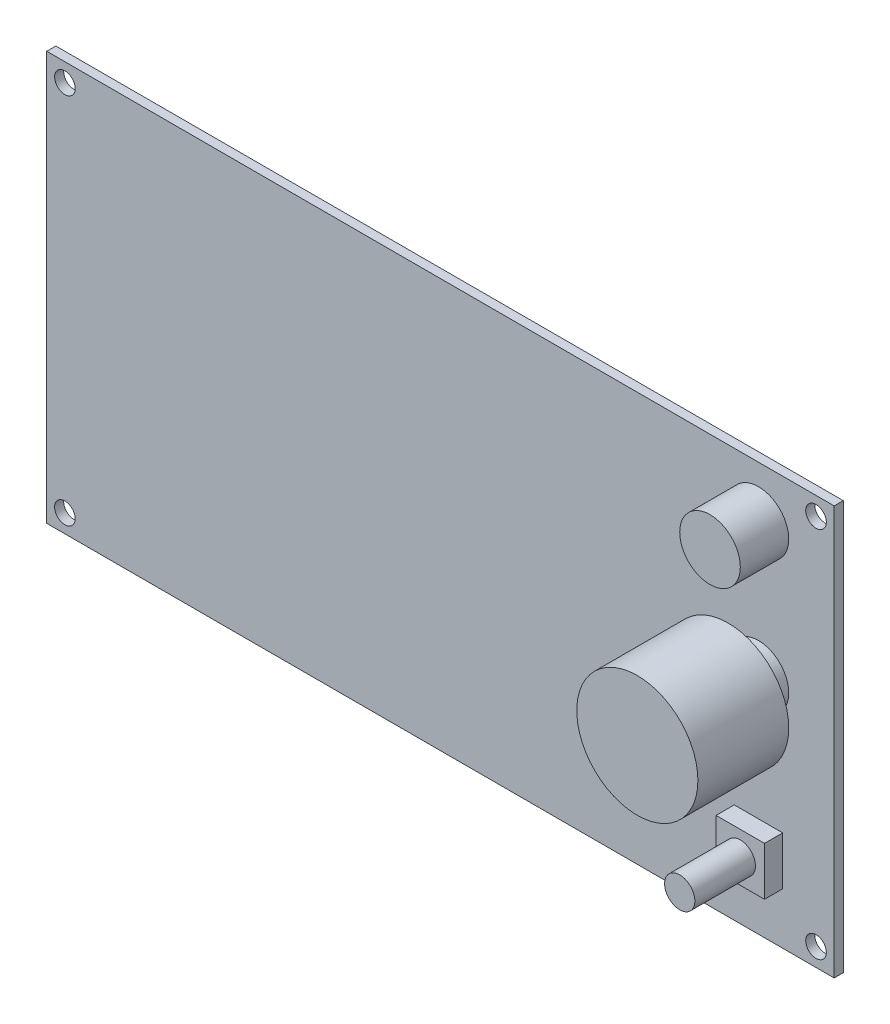
ISO-10303-21;
HEADER;
FILE_DESCRIPTION(('STEP AP214'),'2;1');
FILE_NAME('part.step','',(''),(''),'','','');
FILE_SCHEMA(('AUTOMOTIVE_DESIGN { 1 0 10303 214 1 1 1 1 }'));
ENDSEC;
DATA;
#1=APPLICATION_CONTEXT('core data for automotive mechanical design processes');
#2=APPLICATION_PROTOCOL_DEFINITION('international standard','automotive_design',2000,#1);
#3=PRODUCT_CONTEXT('',#1,'mechanical');
#4=PRODUCT('Part','Part','',(#3));
#5=PRODUCT_RELATED_PRODUCT_CATEGORY('part','',(#4));
#6=PRODUCT_DEFINITION_FORMATION('','',#4);
#7=PRODUCT_DEFINITION_CONTEXT('part definition',#1,'design');
#8=PRODUCT_DEFINITION('design','',#6,#7);
#9=PRODUCT_DEFINITION_SHAPE('','',#8);
#10=(LENGTH_UNIT() NAMED_UNIT(*) SI_UNIT(.MILLI.,.METRE.));
#11=(NAMED_UNIT(*) PLANE_ANGLE_UNIT() SI_UNIT($,.RADIAN.));
#12=(NAMED_UNIT(*) SI_UNIT($,.STERADIAN.) SOLID_ANGLE_UNIT());
#13=UNCERTAINTY_MEASURE_WITH_UNIT(LENGTH_MEASURE(1.E-05),#10,'distance_accuracy_value','');
#14=(GEOMETRIC_REPRESENTATION_CONTEXT(3) GLOBAL_UNCERTAINTY_ASSIGNED_CONTEXT((#13)) GLOBAL_UNIT_ASSIGNED_CONTEXT((#10,
#11,#12)) REPRESENTATION_CONTEXT('',''));
#15=CARTESIAN_POINT('',(0.,0.,0.));
#16=DIRECTION('',(0.,0.,1.));
#17=DIRECTION('',(1.,0.,0.));
#18=AXIS2_PLACEMENT_3D('',#15,#16,#17);
#19=CARTESIAN_POINT('',(0.,0.,0.));
#20=DIRECTION('',(0.,0.,-1.));
#21=DIRECTION('',(-1.,0.,0.));
#22=AXIS2_PLACEMENT_3D('',#19,#20,#21);
#23=PLANE('',#22);
#24=DIRECTION('',(0.,-1.,0.));
#25=VECTOR('',#24,1.);
#26=CARTESIAN_POINT('',(80.,36.5,0.));
#27=LINE('',#26,#25);
#28=CARTESIAN_POINT('',(80.,36.5,0.));
#29=VERTEX_POINT('',#28);
#30=CARTESIAN_POINT('',(80.,29.,0.));
#31=VERTEX_POINT('',#30);
#32=EDGE_CURVE('E61',#29,#31,#27,.T.);
#33=ORIENTED_EDGE('',*,*,#32,.F.);
#34=DIRECTION('',(1.,0.,0.));
#35=VECTOR('',#34,1.);
#36=CARTESIAN_POINT('',(80.,36.5,0.));
#37=LINE('',#36,#35);
#38=CARTESIAN_POINT('',(30.,36.5,0.));
#39=VERTEX_POINT('',#38);
#40=EDGE_CURVE('E186',#39,#29,#37,.T.);
#41=ORIENTED_EDGE('',*,*,#40,.F.);
#42=DIRECTION('',(0.,1.,0.));
#43=VECTOR('',#42,1.);
#44=CARTESIAN_POINT('',(30.,36.5,0.));
#45=LINE('',#44,#43);
#46=CARTESIAN_POINT('',(30.,29.,0.));
#47=VERTEX_POINT('',#46);
#48=EDGE_CURVE('E195',#47,#39,#45,.T.);
#49=ORIENTED_EDGE('',*,*,#48,.F.);
#50=DIRECTION('',(-1.,0.,0.));
#51=VECTOR('',#50,1.);
#52=CARTESIAN_POINT('',(80.,29.,0.));
#53=LINE('',#52,#51);
#54=EDGE_CURVE('E177',#31,#47,#53,.T.);
#55=ORIENTED_EDGE('',*,*,#54,.F.);
#56=EDGE_LOOP('',(#33,#41,#49,#55));
#57=FACE_BOUND('',#56,.T.);
#58=CARTESIAN_POINT('',(124.,61.5,0.));
#59=DIRECTION('',(0.,0.,1.));
#60=DIRECTION('',(1.,0.,0.));
#61=AXIS2_PLACEMENT_3D('',#58,#59,#60);
#62=CIRCLE('',#61,1.70000000000001);
#63=CARTESIAN_POINT('',(125.7,61.5,0.));
#64=VERTEX_POINT('',#63);
#65=EDGE_CURVE('E262',#64,#64,#62,.T.);
#66=ORIENTED_EDGE('',*,*,#65,.T.);
#67=EDGE_LOOP('',(#66));
#68=FACE_BOUND('',#67,.T.);
#69=CARTESIAN_POINT('',(0.,0.,0.));
#70=DIRECTION('',(0.,0.,1.));
#71=DIRECTION('',(1.,0.,0.));
#72=AXIS2_PLACEMENT_3D('',#69,#70,#71);
#73=CIRCLE('',#72,1.7);
#74=CARTESIAN_POINT('',(1.7,0.,0.));
#75=VERTEX_POINT('',#74);
#76=EDGE_CURVE('E274',#75,#75,#73,.T.);
#77=ORIENTED_EDGE('',*,*,#76,.T.);
#78=EDGE_LOOP('',(#77));
#79=FACE_BOUND('',#78,.T.);
#80=DIRECTION('',(1.,0.,0.));
#81=VECTOR('',#80,1.);
#82=CARTESIAN_POINT('',(-3.,-3.,0.));
#83=LINE('',#82,#81);
#84=CARTESIAN_POINT('',(-3.,-3.,0.));
#85=VERTEX_POINT('',#84);
#86=CARTESIAN_POINT('',(127.,-3.,0.));
#87=VERTEX_POINT('',#86);
#88=EDGE_CURVE('E280',#85,#87,#83,.T.);
#89=ORIENTED_EDGE('',*,*,#88,.F.);
#90=DIRECTION('',(0.,-1.,0.));
#91=VECTOR('',#90,1.);
#92=CARTESIAN_POINT('',(-3.,-3.,0.));
#93=LINE('',#92,#91);
#94=CARTESIAN_POINT('',(-3.,64.5,0.));
#95=VERTEX_POINT('',#94);
#96=EDGE_CURVE('E287',#95,#85,#93,.T.);
#97=ORIENTED_EDGE('',*,*,#96,.F.);
#98=DIRECTION('',(-1.,0.,0.));
#99=VECTOR('',#98,1.);
#100=CARTESIAN_POINT('',(-3.,64.5,0.));
#101=LINE('',#100,#99);
#102=CARTESIAN_POINT('',(127.,64.5,0.));
#103=VERTEX_POINT('',#102);
#104=EDGE_CURVE('E298',#103,#95,#101,.T.);
#105=ORIENTED_EDGE('',*,*,#104,.F.);
#106=DIRECTION('',(0.,1.,0.));
#107=VECTOR('',#106,1.);
#108=CARTESIAN_POINT('',(127.,64.5,0.));
#109=LINE('',#108,#107);
#110=EDGE_CURVE('E296',#87,#103,#109,.T.);
#111=ORIENTED_EDGE('',*,*,#110,.F.);
#112=EDGE_LOOP('',(#89,#97,#105,#111));
#113=FACE_BOUND('',#112,.T.);
#114=CARTESIAN_POINT('',(0.,61.5,0.));
#115=DIRECTION('',(0.,0.,1.));
#116=DIRECTION('',(1.,0.,0.));
#117=AXIS2_PLACEMENT_3D('',#114,#115,#116);
#118=CIRCLE('',#117,1.7);
#119=CARTESIAN_POINT('',(1.7,61.5,0.));
#120=VERTEX_POINT('',#119);
#121=EDGE_CURVE('E268',#120,#120,#118,.T.);
#122=ORIENTED_EDGE('',*,*,#121,.T.);
#123=EDGE_LOOP('',(#122));
#124=FACE_BOUND('',#123,.T.);
#125=CARTESIAN_POINT('',(124.,0.,0.));
#126=DIRECTION('',(0.,0.,1.));
#127=DIRECTION('',(1.,0.,0.));
#128=AXIS2_PLACEMENT_3D('',#125,#126,#127);
#129=CIRCLE('',#128,1.70000000000001);
#130=CARTESIAN_POINT('',(125.7,0.,0.));
#131=VERTEX_POINT('',#130);
#132=EDGE_CURVE('E258',#131,#131,#129,.T.);
#133=ORIENTED_EDGE('',*,*,#132,.T.);
#134=EDGE_LOOP('',(#133));
#135=FACE_BOUND('',#134,.T.);
#136=DIRECTION('',(-1.,0.,0.));
#137=VECTOR('',#136,1.);
#138=CARTESIAN_POINT('',(70.5,-0.999999999999986,0.));
#139=LINE('',#138,#137);
#140=CARTESIAN_POINT('',(70.5,-0.999999999999986,0.));
#141=VERTEX_POINT('',#140);
#142=CARTESIAN_POINT('',(18.5,-0.999999999999986,0.));
#143=VERTEX_POINT('',#142);
#144=EDGE_CURVE('E392',#141,#143,#139,.T.);
#145=ORIENTED_EDGE('',*,*,#144,.F.);
#146=DIRECTION('',(0.,-1.,0.));
#147=VECTOR('',#146,1.);
#148=CARTESIAN_POINT('',(70.5,0.500000000000014,0.));
#149=LINE('',#148,#147);
#150=CARTESIAN_POINT('',(70.5,0.500000000000014,0.));
#151=VERTEX_POINT('',#150);
#152=EDGE_CURVE('E174',#151,#141,#149,.T.);
#153=ORIENTED_EDGE('',*,*,#152,.F.);
#154=DIRECTION('',(1.,0.,0.));
#155=VECTOR('',#154,1.);
#156=CARTESIAN_POINT('',(70.5,0.500000000000014,0.));
#157=LINE('',#156,#155);
#158=CARTESIAN_POINT('',(18.5,0.500000000000014,0.));
#159=VERTEX_POINT('',#158);
#160=EDGE_CURVE('E170',#159,#151,#157,.T.);
#161=ORIENTED_EDGE('',*,*,#160,.F.);
#162=DIRECTION('',(0.,1.,0.));
#163=VECTOR('',#162,1.);
#164=CARTESIAN_POINT('',(18.5,0.500000000000014,0.));
#165=LINE('',#164,#163);
#166=EDGE_CURVE('E394',#143,#159,#165,.T.);
#167=ORIENTED_EDGE('',*,*,#166,.F.);
#168=EDGE_LOOP('',(#145,#153,#161,#167));
#169=FACE_BOUND('',#168,.T.);
#170=ADVANCED_FACE('F37',(#57,#68,#79,#113,#124,#135,#169),#23,.T.);
#171=CARTESIAN_POINT('',(0.,0.,1.5));
#172=DIRECTION('',(0.,0.,-1.));
#173=DIRECTION('',(-1.,0.,0.));
#174=AXIS2_PLACEMENT_3D('',#171,#172,#173);
#175=PLANE('',#174);
#176=CARTESIAN_POINT('',(124.,0.,1.5));
#177=DIRECTION('',(0.,0.,1.));
#178=DIRECTION('',(1.,0.,0.));
#179=AXIS2_PLACEMENT_3D('',#176,#177,#178);
#180=CIRCLE('',#179,1.70000000000001);
#181=CARTESIAN_POINT('',(125.7,0.,1.5));
#182=VERTEX_POINT('',#181);
#183=EDGE_CURVE('E259',#182,#182,#180,.T.);
#184=ORIENTED_EDGE('',*,*,#183,.F.);
#185=EDGE_LOOP('',(#184));
#186=FACE_BOUND('',#185,.T.);
#187=CARTESIAN_POINT('',(124.,61.5,1.5));
#188=DIRECTION('',(0.,0.,1.));
#189=DIRECTION('',(1.,0.,0.));
#190=AXIS2_PLACEMENT_3D('',#187,#188,#189);
#191=CIRCLE('',#190,1.70000000000001);
#192=CARTESIAN_POINT('',(125.7,61.5,1.5));
#193=VERTEX_POINT('',#192);
#194=EDGE_CURVE('E265',#193,#193,#191,.T.);
#195=ORIENTED_EDGE('',*,*,#194,.F.);
#196=EDGE_LOOP('',(#195));
#197=FACE_BOUND('',#196,.T.);
#198=CARTESIAN_POINT('',(0.,61.5,1.5));
#199=DIRECTION('',(0.,0.,1.));
#200=DIRECTION('',(1.,0.,0.));
#201=AXIS2_PLACEMENT_3D('',#198,#199,#200);
#202=CIRCLE('',#201,1.7);
#203=CARTESIAN_POINT('',(1.7,61.5,1.5));
#204=VERTEX_POINT('',#203);
#205=EDGE_CURVE('E271',#204,#204,#202,.T.);
#206=ORIENTED_EDGE('',*,*,#205,.F.);
#207=EDGE_LOOP('',(#206));
#208=FACE_BOUND('',#207,.T.);
#209=CARTESIAN_POINT('',(0.,0.,1.5));
#210=DIRECTION('',(0.,0.,1.));
#211=DIRECTION('',(1.,0.,0.));
#212=AXIS2_PLACEMENT_3D('',#209,#210,#211);
#213=CIRCLE('',#212,1.7);
#214=CARTESIAN_POINT('',(1.7,0.,1.5));
#215=VERTEX_POINT('',#214);
#216=EDGE_CURVE('E277',#215,#215,#213,.T.);
#217=ORIENTED_EDGE('',*,*,#216,.F.);
#218=EDGE_LOOP('',(#217));
#219=FACE_BOUND('',#218,.T.);
#220=DIRECTION('',(1.,0.,0.));
#221=VECTOR('',#220,1.);
#222=CARTESIAN_POINT('',(-3.,-3.,1.5));
#223=LINE('',#222,#221);
#224=CARTESIAN_POINT('',(-3.,-3.,1.5));
#225=VERTEX_POINT('',#224);
#226=CARTESIAN_POINT('',(127.,-3.,1.5));
#227=VERTEX_POINT('',#226);
#228=EDGE_CURVE('E283',#225,#227,#223,.T.);
#229=ORIENTED_EDGE('',*,*,#228,.T.);
#230=DIRECTION('',(0.,1.,0.));
#231=VECTOR('',#230,1.);
#232=CARTESIAN_POINT('',(127.,64.5,1.5));
#233=LINE('',#232,#231);
#234=CARTESIAN_POINT('',(127.,64.5,1.5));
#235=VERTEX_POINT('',#234);
#236=EDGE_CURVE('E286',#227,#235,#233,.T.);
#237=ORIENTED_EDGE('',*,*,#236,.T.);
#238=DIRECTION('',(-1.,0.,0.));
#239=VECTOR('',#238,1.);
#240=CARTESIAN_POINT('',(-3.,64.5,1.5));
#241=LINE('',#240,#239);
#242=CARTESIAN_POINT('',(-3.,64.5,1.5));
#243=VERTEX_POINT('',#242);
#244=EDGE_CURVE('E289',#235,#243,#241,.T.);
#245=ORIENTED_EDGE('',*,*,#244,.T.);
#246=DIRECTION('',(0.,-1.,0.));
#247=VECTOR('',#246,1.);
#248=CARTESIAN_POINT('',(-3.,-3.,1.5));
#249=LINE('',#248,#247);
#250=EDGE_CURVE('E291',#243,#225,#249,.T.);
#251=ORIENTED_EDGE('',*,*,#250,.T.);
#252=EDGE_LOOP('',(#229,#237,#245,#251));
#253=FACE_BOUND('',#252,.T.);
#254=CARTESIAN_POINT('',(114.5,56.,1.5));
#255=DIRECTION('',(0.,0.,-1.));
#256=DIRECTION('',(-1.,0.,0.));
#257=AXIS2_PLACEMENT_3D('',#254,#255,#256);
#258=CIRCLE('',#257,5.00000000000001);
#259=CARTESIAN_POINT('',(109.5,56.,1.5));
#260=VERTEX_POINT('',#259);
#261=EDGE_CURVE('E311',#260,#260,#258,.F.);
#262=ORIENTED_EDGE('',*,*,#261,.F.);
#263=EDGE_LOOP('',(#262));
#264=FACE_BOUND('',#263,.T.);
#265=CARTESIAN_POINT('',(114.5,34.,1.5));
#266=DIRECTION('',(0.,0.,-1.));
#267=DIRECTION('',(-1.,0.,0.));
#268=AXIS2_PLACEMENT_3D('',#265,#266,#267);
#269=CIRCLE('',#268,5.00000000000001);
#270=CARTESIAN_POINT('',(109.5,34.,1.5));
#271=VERTEX_POINT('',#270);
#272=EDGE_CURVE('E41',#271,#271,#269,.F.);
#273=ORIENTED_EDGE('',*,*,#272,.F.);
#274=EDGE_LOOP('',(#273));
#275=FACE_BOUND('',#274,.T.);
#276=DIRECTION('',(0.,1.,0.));
#277=VECTOR('',#276,1.);
#278=CARTESIAN_POINT('',(118.5,13.5,1.5));
#279=LINE('',#278,#277);
#280=CARTESIAN_POINT('',(118.5,5.5,1.5));
#281=VERTEX_POINT('',#280);
#282=CARTESIAN_POINT('',(118.5,13.5,1.5));
#283=VERTEX_POINT('',#282);
#284=EDGE_CURVE('E212',#281,#283,#279,.T.);
#285=ORIENTED_EDGE('',*,*,#284,.F.);
#286=DIRECTION('',(1.,0.,0.));
#287=VECTOR('',#286,1.);
#288=CARTESIAN_POINT('',(110.5,5.5,1.5));
#289=LINE('',#288,#287);
#290=CARTESIAN_POINT('',(110.5,5.5,1.5));
#291=VERTEX_POINT('',#290);
#292=EDGE_CURVE('E218',#291,#281,#289,.T.);
#293=ORIENTED_EDGE('',*,*,#292,.F.);
#294=DIRECTION('',(0.,-1.,0.));
#295=VECTOR('',#294,1.);
#296=CARTESIAN_POINT('',(110.5,13.5,1.5));
#297=LINE('',#296,#295);
#298=CARTESIAN_POINT('',(110.5,13.5,1.5));
#299=VERTEX_POINT('',#298);
#300=EDGE_CURVE('E230',#299,#291,#297,.T.);
#301=ORIENTED_EDGE('',*,*,#300,.F.);
#302=DIRECTION('',(-1.,0.,0.));
#303=VECTOR('',#302,1.);
#304=CARTESIAN_POINT('',(110.5,13.5,1.5));
#305=LINE('',#304,#303);
#306=EDGE_CURVE('E227',#283,#299,#305,.T.);
#307=ORIENTED_EDGE('',*,*,#306,.F.);
#308=EDGE_LOOP('',(#285,#293,#301,#307));
#309=FACE_BOUND('',#308,.T.);
#310=ADVANCED_FACE('F320',(#186,#197,#208,#219,#253,#264,#275,#309),#175,.F.);
#311=CARTESIAN_POINT('',(-3.,-3.,1.5));
#312=DIRECTION('',(0.,1.,0.));
#313=DIRECTION('',(0.,0.,1.));
#314=AXIS2_PLACEMENT_3D('',#311,#312,#313);
#315=PLANE('',#314);
#316=ORIENTED_EDGE('',*,*,#88,.T.);
#317=DIRECTION('',(0.,0.,-1.));
#318=VECTOR('',#317,1.);
#319=CARTESIAN_POINT('',(127.,-3.,1.5));
#320=LINE('',#319,#318);
#321=EDGE_CURVE('E309',#227,#87,#320,.T.);
#322=ORIENTED_EDGE('',*,*,#321,.F.);
#323=ORIENTED_EDGE('',*,*,#228,.F.);
#324=DIRECTION('',(0.,0.,-1.));
#325=VECTOR('',#324,1.);
#326=CARTESIAN_POINT('',(-3.,-3.,1.5));
#327=LINE('',#326,#325);
#328=EDGE_CURVE('E293',#225,#85,#327,.T.);
#329=ORIENTED_EDGE('',*,*,#328,.T.);
#330=EDGE_LOOP('',(#316,#322,#323,#329));
#331=FACE_BOUND('',#330,.T.);
#332=ADVANCED_FACE('F39',(#331),#315,.F.);
#333=CARTESIAN_POINT('',(127.,64.5,1.5));
#334=DIRECTION('',(-1.,0.,0.));
#335=DIRECTION('',(0.,0.,1.));
#336=AXIS2_PLACEMENT_3D('',#333,#334,#335);
#337=PLANE('',#336);
#338=ORIENTED_EDGE('',*,*,#110,.T.);
#339=DIRECTION('',(0.,0.,-1.));
#340=VECTOR('',#339,1.);
#341=CARTESIAN_POINT('',(127.,64.5,1.5));
#342=LINE('',#341,#340);
#343=EDGE_CURVE('E306',#235,#103,#342,.T.);
#344=ORIENTED_EDGE('',*,*,#343,.F.);
#345=ORIENTED_EDGE('',*,*,#236,.F.);
#346=ORIENTED_EDGE('',*,*,#321,.T.);
#347=EDGE_LOOP('',(#338,#344,#345,#346));
#348=FACE_BOUND('',#347,.T.);
#349=ADVANCED_FACE('F365',(#348),#337,.F.);
#350=CARTESIAN_POINT('',(-3.,64.5,1.5));
#351=DIRECTION('',(0.,-1.,0.));
#352=DIRECTION('',(0.,0.,-1.));
#353=AXIS2_PLACEMENT_3D('',#350,#351,#352);
#354=PLANE('',#353);
#355=ORIENTED_EDGE('',*,*,#104,.T.);
#356=DIRECTION('',(0.,0.,-1.));
#357=VECTOR('',#356,1.);
#358=CARTESIAN_POINT('',(-3.,64.5,1.5));
#359=LINE('',#358,#357);
#360=EDGE_CURVE('E303',#243,#95,#359,.T.);
#361=ORIENTED_EDGE('',*,*,#360,.F.);
#362=ORIENTED_EDGE('',*,*,#244,.F.);
#363=ORIENTED_EDGE('',*,*,#343,.T.);
#364=EDGE_LOOP('',(#355,#361,#362,#363));
#365=FACE_BOUND('',#364,.T.);
#366=ADVANCED_FACE('F362',(#365),#354,.F.);
#367=CARTESIAN_POINT('',(-3.,-3.,1.5));
#368=DIRECTION('',(1.,0.,0.));
#369=DIRECTION('',(0.,0.,-1.));
#370=AXIS2_PLACEMENT_3D('',#367,#368,#369);
#371=PLANE('',#370);
#372=ORIENTED_EDGE('',*,*,#96,.T.);
#373=ORIENTED_EDGE('',*,*,#328,.F.);
#374=ORIENTED_EDGE('',*,*,#250,.F.);
#375=ORIENTED_EDGE('',*,*,#360,.T.);
#376=EDGE_LOOP('',(#372,#373,#374,#375));
#377=FACE_BOUND('',#376,.T.);
#378=ADVANCED_FACE('F358',(#377),#371,.F.);
#379=CARTESIAN_POINT('',(0.,0.,1.5));
#380=DIRECTION('',(0.,0.,-1.));
#381=DIRECTION('',(-1.,0.,0.));
#382=AXIS2_PLACEMENT_3D('',#379,#380,#381);
#383=CYLINDRICAL_SURFACE('',#382,1.7);
#384=ORIENTED_EDGE('',*,*,#216,.T.);
#385=EDGE_LOOP('',(#384));
#386=FACE_BOUND('',#385,.T.);
#387=ORIENTED_EDGE('',*,*,#76,.F.);
#388=EDGE_LOOP('',(#387));
#389=FACE_BOUND('',#388,.T.);
#390=ADVANCED_FACE('F361',(#386,#389),#383,.F.);
#391=CARTESIAN_POINT('',(0.,61.5,1.5));
#392=DIRECTION('',(0.,0.,-1.));
#393=DIRECTION('',(-1.,0.,0.));
#394=AXIS2_PLACEMENT_3D('',#391,#392,#393);
#395=CYLINDRICAL_SURFACE('',#394,1.7);
#396=ORIENTED_EDGE('',*,*,#205,.T.);
#397=EDGE_LOOP('',(#396));
#398=FACE_BOUND('',#397,.T.);
#399=ORIENTED_EDGE('',*,*,#121,.F.);
#400=EDGE_LOOP('',(#399));
#401=FACE_BOUND('',#400,.T.);
#402=ADVANCED_FACE('F625',(#398,#401),#395,.F.);
#403=CARTESIAN_POINT('',(124.,61.5,1.5));
#404=DIRECTION('',(0.,0.,-1.));
#405=DIRECTION('',(-1.,0.,0.));
#406=AXIS2_PLACEMENT_3D('',#403,#404,#405);
#407=CYLINDRICAL_SURFACE('',#406,1.70000000000001);
#408=ORIENTED_EDGE('',*,*,#194,.T.);
#409=EDGE_LOOP('',(#408));
#410=FACE_BOUND('',#409,.T.);
#411=ORIENTED_EDGE('',*,*,#65,.F.);
#412=EDGE_LOOP('',(#411));
#413=FACE_BOUND('',#412,.T.);
#414=ADVANCED_FACE('F616',(#410,#413),#407,.F.);
#415=CARTESIAN_POINT('',(124.,0.,1.5));
#416=DIRECTION('',(0.,0.,-1.));
#417=DIRECTION('',(-1.,0.,0.));
#418=AXIS2_PLACEMENT_3D('',#415,#416,#417);
#419=CYLINDRICAL_SURFACE('',#418,1.70000000000001);
#420=ORIENTED_EDGE('',*,*,#183,.T.);
#421=EDGE_LOOP('',(#420));
#422=FACE_BOUND('',#421,.T.);
#423=ORIENTED_EDGE('',*,*,#132,.F.);
#424=EDGE_LOOP('',(#423));
#425=FACE_BOUND('',#424,.T.);
#426=ADVANCED_FACE('F607',(#422,#425),#419,.F.);
#427=CARTESIAN_POINT('',(114.5,56.,9.5));
#428=DIRECTION('',(0.,0.,-1.));
#429=DIRECTION('',(-1.,0.,0.));
#430=AXIS2_PLACEMENT_3D('',#427,#428,#429);
#431=CYLINDRICAL_SURFACE('',#430,5.00000000000001);
#432=CARTESIAN_POINT('',(114.5,56.,9.5));
#433=DIRECTION('',(0.,0.,1.));
#434=DIRECTION('',(1.,0.,0.));
#435=AXIS2_PLACEMENT_3D('',#432,#433,#434);
#436=CIRCLE('',#435,5.00000000000001);
#437=CARTESIAN_POINT('',(119.5,56.,9.5));
#438=VERTEX_POINT('',#437);
#439=EDGE_CURVE('E255',#438,#438,#436,.T.);
#440=ORIENTED_EDGE('',*,*,#439,.F.);
#441=EDGE_LOOP('',(#440));
#442=FACE_BOUND('',#441,.T.);
#443=ORIENTED_EDGE('',*,*,#261,.T.);
#444=EDGE_LOOP('',(#443));
#445=FACE_BOUND('',#444,.T.);
#446=ADVANCED_FACE('F598',(#442,#445),#431,.T.);
#447=CARTESIAN_POINT('',(114.5,56.,9.5));
#448=DIRECTION('',(0.,0.,1.));
#449=DIRECTION('',(1.,0.,0.));
#450=AXIS2_PLACEMENT_3D('',#447,#448,#449);
#451=PLANE('',#450);
#452=ORIENTED_EDGE('',*,*,#439,.T.);
#453=EDGE_LOOP('',(#452));
#454=FACE_BOUND('',#453,.T.);
#455=ADVANCED_FACE('F589',(#454),#451,.T.);
#456=CARTESIAN_POINT('',(114.5,34.,6.5));
#457=DIRECTION('',(0.,0.,-1.));
#458=DIRECTION('',(-1.,0.,0.));
#459=AXIS2_PLACEMENT_3D('',#456,#457,#458);
#460=CYLINDRICAL_SURFACE('',#459,5.00000000000001);
#461=CARTESIAN_POINT('',(114.5,34.,6.5));
#462=DIRECTION('',(0.,0.,1.));
#463=DIRECTION('',(1.,0.,0.));
#464=AXIS2_PLACEMENT_3D('',#461,#462,#463);
#465=CIRCLE('',#464,5.00000000000001);
#466=CARTESIAN_POINT('',(119.5,34.,6.5));
#467=VERTEX_POINT('',#466);
#468=EDGE_CURVE('E250',#467,#467,#465,.T.);
#469=ORIENTED_EDGE('',*,*,#468,.F.);
#470=EDGE_LOOP('',(#469));
#471=FACE_BOUND('',#470,.T.);
#472=ORIENTED_EDGE('',*,*,#272,.T.);
#473=EDGE_LOOP('',(#472));
#474=FACE_BOUND('',#473,.T.);
#475=ADVANCED_FACE('F318',(#471,#474),#460,.T.);
#476=CARTESIAN_POINT('',(114.5,34.,21.5));
#477=DIRECTION('',(0.,0.,-1.));
#478=DIRECTION('',(-1.,0.,0.));
#479=AXIS2_PLACEMENT_3D('',#476,#477,#478);
#480=CYLINDRICAL_SURFACE('',#479,9.99999999999999);
#481=CARTESIAN_POINT('',(114.5,34.,21.5));
#482=DIRECTION('',(0.,0.,1.));
#483=DIRECTION('',(1.,0.,0.));
#484=AXIS2_PLACEMENT_3D('',#481,#482,#483);
#485=CIRCLE('',#484,9.99999999999999);
#486=CARTESIAN_POINT('',(124.5,34.,21.5));
#487=VERTEX_POINT('',#486);
#488=EDGE_CURVE('E247',#487,#487,#485,.T.);
#489=ORIENTED_EDGE('',*,*,#488,.F.);
#490=EDGE_LOOP('',(#489));
#491=FACE_BOUND('',#490,.T.);
#492=CARTESIAN_POINT('',(114.5,34.,6.5));
#493=DIRECTION('',(0.,0.,1.));
#494=DIRECTION('',(1.,0.,0.));
#495=AXIS2_PLACEMENT_3D('',#492,#493,#494);
#496=CIRCLE('',#495,9.99999999999999);
#497=CARTESIAN_POINT('',(124.5,34.,6.5));
#498=VERTEX_POINT('',#497);
#499=EDGE_CURVE('E246',#498,#498,#496,.T.);
#500=ORIENTED_EDGE('',*,*,#499,.T.);
#501=EDGE_LOOP('',(#500));
#502=FACE_BOUND('',#501,.T.);
#503=ADVANCED_FACE('F572',(#491,#502),#480,.T.);
#504=CARTESIAN_POINT('',(114.5,34.,21.5));
#505=DIRECTION('',(0.,0.,1.));
#506=DIRECTION('',(1.,0.,0.));
#507=AXIS2_PLACEMENT_3D('',#504,#505,#506);
#508=PLANE('',#507);
#509=ORIENTED_EDGE('',*,*,#488,.T.);
#510=EDGE_LOOP('',(#509));
#511=FACE_BOUND('',#510,.T.);
#512=ADVANCED_FACE('F563',(#511),#508,.T.);
#513=CARTESIAN_POINT('',(114.5,34.,6.5));
#514=DIRECTION('',(0.,0.,1.));
#515=DIRECTION('',(1.,0.,0.));
#516=AXIS2_PLACEMENT_3D('',#513,#514,#515);
#517=PLANE('',#516);
#518=ORIENTED_EDGE('',*,*,#468,.T.);
#519=EDGE_LOOP('',(#518));
#520=FACE_BOUND('',#519,.T.);
#521=ORIENTED_EDGE('',*,*,#499,.F.);
#522=EDGE_LOOP('',(#521));
#523=FACE_BOUND('',#522,.T.);
#524=ADVANCED_FACE('F349',(#520,#523),#517,.F.);
#525=CARTESIAN_POINT('',(118.5,13.5,4.5));
#526=DIRECTION('',(-1.,0.,0.));
#527=DIRECTION('',(0.,0.,1.));
#528=AXIS2_PLACEMENT_3D('',#525,#526,#527);
#529=PLANE('',#528);
#530=ORIENTED_EDGE('',*,*,#284,.T.);
#531=DIRECTION('',(0.,0.,-1.));
#532=VECTOR('',#531,1.);
#533=CARTESIAN_POINT('',(118.5,13.5,4.5));
#534=LINE('',#533,#532);
#535=CARTESIAN_POINT('',(118.5,13.5,4.5));
#536=VERTEX_POINT('',#535);
#537=EDGE_CURVE('E243',#536,#283,#534,.T.);
#538=ORIENTED_EDGE('',*,*,#537,.F.);
#539=DIRECTION('',(0.,1.,0.));
#540=VECTOR('',#539,1.);
#541=CARTESIAN_POINT('',(118.5,13.5,4.5));
#542=LINE('',#541,#540);
#543=CARTESIAN_POINT('',(118.5,5.5,4.5));
#544=VERTEX_POINT('',#543);
#545=EDGE_CURVE('E214',#544,#536,#542,.T.);
#546=ORIENTED_EDGE('',*,*,#545,.F.);
#547=DIRECTION('',(0.,0.,-1.));
#548=VECTOR('',#547,1.);
#549=CARTESIAN_POINT('',(118.5,5.5,4.5));
#550=LINE('',#549,#548);
#551=EDGE_CURVE('E224',#544,#281,#550,.T.);
#552=ORIENTED_EDGE('',*,*,#551,.T.);
#553=EDGE_LOOP('',(#530,#538,#546,#552));
#554=FACE_BOUND('',#553,.T.);
#555=ADVANCED_FACE('F333',(#554),#529,.F.);
#556=CARTESIAN_POINT('',(110.5,13.5,4.5));
#557=DIRECTION('',(0.,-1.,0.));
#558=DIRECTION('',(0.,0.,-1.));
#559=AXIS2_PLACEMENT_3D('',#556,#557,#558);
#560=PLANE('',#559);
#561=ORIENTED_EDGE('',*,*,#306,.T.);
#562=DIRECTION('',(0.,0.,-1.));
#563=VECTOR('',#562,1.);
#564=CARTESIAN_POINT('',(110.5,13.5,4.5));
#565=LINE('',#564,#563);
#566=CARTESIAN_POINT('',(110.5,13.5,4.5));
#567=VERTEX_POINT('',#566);
#568=EDGE_CURVE('E240',#567,#299,#565,.T.);
#569=ORIENTED_EDGE('',*,*,#568,.F.);
#570=DIRECTION('',(-1.,0.,0.));
#571=VECTOR('',#570,1.);
#572=CARTESIAN_POINT('',(110.5,13.5,4.5));
#573=LINE('',#572,#571);
#574=EDGE_CURVE('E217',#536,#567,#573,.T.);
#575=ORIENTED_EDGE('',*,*,#574,.F.);
#576=ORIENTED_EDGE('',*,*,#537,.T.);
#577=EDGE_LOOP('',(#561,#569,#575,#576));
#578=FACE_BOUND('',#577,.T.);
#579=ADVANCED_FACE('F341',(#578),#560,.F.);
#580=CARTESIAN_POINT('',(110.5,13.5,4.5));
#581=DIRECTION('',(1.,0.,0.));
#582=DIRECTION('',(0.,0.,-1.));
#583=AXIS2_PLACEMENT_3D('',#580,#581,#582);
#584=PLANE('',#583);
#585=ORIENTED_EDGE('',*,*,#300,.T.);
#586=DIRECTION('',(0.,0.,-1.));
#587=VECTOR('',#586,1.);
#588=CARTESIAN_POINT('',(110.5,5.5,4.5));
#589=LINE('',#588,#587);
#590=CARTESIAN_POINT('',(110.5,5.5,4.5));
#591=VERTEX_POINT('',#590);
#592=EDGE_CURVE('E237',#591,#291,#589,.T.);
#593=ORIENTED_EDGE('',*,*,#592,.F.);
#594=DIRECTION('',(0.,-1.,0.));
#595=VECTOR('',#594,1.);
#596=CARTESIAN_POINT('',(110.5,13.5,4.5));
#597=LINE('',#596,#595);
#598=EDGE_CURVE('E220',#567,#591,#597,.T.);
#599=ORIENTED_EDGE('',*,*,#598,.F.);
#600=ORIENTED_EDGE('',*,*,#568,.T.);
#601=EDGE_LOOP('',(#585,#593,#599,#600));
#602=FACE_BOUND('',#601,.T.);
#603=ADVANCED_FACE('F339',(#602),#584,.F.);
#604=CARTESIAN_POINT('',(110.5,5.5,4.5));
#605=DIRECTION('',(0.,1.,0.));
#606=DIRECTION('',(0.,0.,1.));
#607=AXIS2_PLACEMENT_3D('',#604,#605,#606);
#608=PLANE('',#607);
#609=ORIENTED_EDGE('',*,*,#292,.T.);
#610=ORIENTED_EDGE('',*,*,#551,.F.);
#611=DIRECTION('',(1.,0.,0.));
#612=VECTOR('',#611,1.);
#613=CARTESIAN_POINT('',(110.5,5.5,4.5));
#614=LINE('',#613,#612);
#615=EDGE_CURVE('E222',#591,#544,#614,.T.);
#616=ORIENTED_EDGE('',*,*,#615,.F.);
#617=ORIENTED_EDGE('',*,*,#592,.T.);
#618=EDGE_LOOP('',(#609,#610,#616,#617));
#619=FACE_BOUND('',#618,.T.);
#620=ADVANCED_FACE('F329',(#619),#608,.F.);
#621=CARTESIAN_POINT('',(0.,0.,4.5));
#622=DIRECTION('',(0.,0.,1.));
#623=DIRECTION('',(1.,0.,0.));
#624=AXIS2_PLACEMENT_3D('',#621,#622,#623);
#625=PLANE('',#624);
#626=CARTESIAN_POINT('',(114.5,9.5,4.5));
#627=DIRECTION('',(0.,0.,1.));
#628=DIRECTION('',(1.,0.,0.));
#629=AXIS2_PLACEMENT_3D('',#626,#627,#628);
#630=CIRCLE('',#629,2.50000000000001);
#631=CARTESIAN_POINT('',(117.,9.5,4.5));
#632=VERTEX_POINT('',#631);
#633=EDGE_CURVE('E11',#632,#632,#630,.T.);
#634=ORIENTED_EDGE('',*,*,#633,.F.);
#635=EDGE_LOOP('',(#634));
#636=FACE_BOUND('',#635,.T.);
#637=ORIENTED_EDGE('',*,*,#545,.T.);
#638=ORIENTED_EDGE('',*,*,#574,.T.);
#639=ORIENTED_EDGE('',*,*,#598,.T.);
#640=ORIENTED_EDGE('',*,*,#615,.T.);
#641=EDGE_LOOP('',(#637,#638,#639,#640));
#642=FACE_BOUND('',#641,.T.);
#643=ADVANCED_FACE('F335',(#636,#642),#625,.T.);
#644=CARTESIAN_POINT('',(114.5,9.5,14.5));
#645=DIRECTION('',(0.,0.,-1.));
#646=DIRECTION('',(-1.,0.,0.));
#647=AXIS2_PLACEMENT_3D('',#644,#645,#646);
#648=CYLINDRICAL_SURFACE('',#647,2.50000000000001);
#649=CARTESIAN_POINT('',(114.5,9.5,14.5));
#650=DIRECTION('',(0.,0.,1.));
#651=DIRECTION('',(1.,0.,0.));
#652=AXIS2_PLACEMENT_3D('',#649,#650,#651);
#653=CIRCLE('',#652,2.50000000000001);
#654=CARTESIAN_POINT('',(117.,9.5,14.5));
#655=VERTEX_POINT('',#654);
#656=EDGE_CURVE('E210',#655,#655,#653,.T.);
#657=ORIENTED_EDGE('',*,*,#656,.F.);
#658=EDGE_LOOP('',(#657));
#659=FACE_BOUND('',#658,.T.);
#660=ORIENTED_EDGE('',*,*,#633,.T.);
#661=EDGE_LOOP('',(#660));
#662=FACE_BOUND('',#661,.T.);
#663=ADVANCED_FACE('F442',(#659,#662),#648,.T.);
#664=CARTESIAN_POINT('',(114.5,9.5,14.5));
#665=DIRECTION('',(0.,0.,1.));
#666=DIRECTION('',(1.,0.,0.));
#667=AXIS2_PLACEMENT_3D('',#664,#665,#666);
#668=PLANE('',#667);
#669=ORIENTED_EDGE('',*,*,#656,.T.);
#670=EDGE_LOOP('',(#669));
#671=FACE_BOUND('',#670,.T.);
#672=ADVANCED_FACE('F438',(#671),#668,.T.);
#673=CARTESIAN_POINT('',(80.,36.5,-5.));
#674=DIRECTION('',(-1.,0.,0.));
#675=DIRECTION('',(0.,-1.,0.));
#676=AXIS2_PLACEMENT_3D('',#673,#674,#675);
#677=PLANE('',#676);
#678=ORIENTED_EDGE('',*,*,#32,.T.);
#679=DIRECTION('',(0.,0.,1.));
#680=VECTOR('',#679,1.);
#681=CARTESIAN_POINT('',(80.,29.,-5.));
#682=LINE('',#681,#680);
#683=CARTESIAN_POINT('',(80.,29.,-5.));
#684=VERTEX_POINT('',#683);
#685=EDGE_CURVE('E207',#684,#31,#682,.T.);
#686=ORIENTED_EDGE('',*,*,#685,.F.);
#687=DIRECTION('',(0.,-1.,0.));
#688=VECTOR('',#687,1.);
#689=CARTESIAN_POINT('',(80.,36.5,-5.));
#690=LINE('',#689,#688);
#691=CARTESIAN_POINT('',(80.,36.5,-5.));
#692=VERTEX_POINT('',#691);
#693=EDGE_CURVE('E182',#692,#684,#690,.T.);
#694=ORIENTED_EDGE('',*,*,#693,.F.);
#695=DIRECTION('',(0.,0.,1.));
#696=VECTOR('',#695,1.);
#697=CARTESIAN_POINT('',(80.,36.5,-5.));
#698=LINE('',#697,#696);
#699=EDGE_CURVE('E191',#692,#29,#698,.T.);
#700=ORIENTED_EDGE('',*,*,#699,.T.);
#701=EDGE_LOOP('',(#678,#686,#694,#700));
#702=FACE_BOUND('',#701,.T.);
#703=ADVANCED_FACE('F434',(#702),#677,.F.);
#704=CARTESIAN_POINT('',(80.,29.,-5.));
#705=DIRECTION('',(0.,1.,0.));
#706=DIRECTION('',(-1.,0.,0.));
#707=AXIS2_PLACEMENT_3D('',#704,#705,#706);
#708=PLANE('',#707);
#709=ORIENTED_EDGE('',*,*,#54,.T.);
#710=DIRECTION('',(0.,0.,1.));
#711=VECTOR('',#710,1.);
#712=CARTESIAN_POINT('',(30.,29.,-5.));
#713=LINE('',#712,#711);
#714=CARTESIAN_POINT('',(30.,29.,-5.));
#715=VERTEX_POINT('',#714);
#716=EDGE_CURVE('E204',#715,#47,#713,.T.);
#717=ORIENTED_EDGE('',*,*,#716,.F.);
#718=DIRECTION('',(-1.,0.,0.));
#719=VECTOR('',#718,1.);
#720=CARTESIAN_POINT('',(80.,29.,-5.));
#721=LINE('',#720,#719);
#722=EDGE_CURVE('E185',#684,#715,#721,.T.);
#723=ORIENTED_EDGE('',*,*,#722,.F.);
#724=ORIENTED_EDGE('',*,*,#685,.T.);
#725=EDGE_LOOP('',(#709,#717,#723,#724));
#726=FACE_BOUND('',#725,.T.);
#727=ADVANCED_FACE('F430',(#726),#708,.F.);
#728=CARTESIAN_POINT('',(30.,36.5,-5.));
#729=DIRECTION('',(1.,0.,0.));
#730=DIRECTION('',(0.,0.,-1.));
#731=AXIS2_PLACEMENT_3D('',#728,#729,#730);
#732=PLANE('',#731);
#733=ORIENTED_EDGE('',*,*,#48,.T.);
#734=DIRECTION('',(0.,0.,1.));
#735=VECTOR('',#734,1.);
#736=CARTESIAN_POINT('',(30.,36.5,-5.));
#737=LINE('',#736,#735);
#738=CARTESIAN_POINT('',(30.,36.5,-5.));
#739=VERTEX_POINT('',#738);
#740=EDGE_CURVE('E201',#739,#39,#737,.T.);
#741=ORIENTED_EDGE('',*,*,#740,.F.);
#742=DIRECTION('',(0.,1.,0.));
#743=VECTOR('',#742,1.);
#744=CARTESIAN_POINT('',(30.,36.5,-5.));
#745=LINE('',#744,#743);
#746=EDGE_CURVE('E188',#715,#739,#745,.T.);
#747=ORIENTED_EDGE('',*,*,#746,.F.);
#748=ORIENTED_EDGE('',*,*,#716,.T.);
#749=EDGE_LOOP('',(#733,#741,#747,#748));
#750=FACE_BOUND('',#749,.T.);
#751=ADVANCED_FACE('F426',(#750),#732,.F.);
#752=CARTESIAN_POINT('',(80.,36.5,-5.));
#753=DIRECTION('',(0.,-1.,0.));
#754=DIRECTION('',(1.,0.,0.));
#755=AXIS2_PLACEMENT_3D('',#752,#753,#754);
#756=PLANE('',#755);
#757=ORIENTED_EDGE('',*,*,#40,.T.);
#758=ORIENTED_EDGE('',*,*,#699,.F.);
#759=DIRECTION('',(1.,0.,0.));
#760=VECTOR('',#759,1.);
#761=CARTESIAN_POINT('',(80.,36.5,-5.));
#762=LINE('',#761,#760);
#763=EDGE_CURVE('E190',#739,#692,#762,.T.);
#764=ORIENTED_EDGE('',*,*,#763,.F.);
#765=ORIENTED_EDGE('',*,*,#740,.T.);
#766=EDGE_LOOP('',(#757,#758,#764,#765));
#767=FACE_BOUND('',#766,.T.);
#768=ADVANCED_FACE('F422',(#767),#756,.F.);
#769=CARTESIAN_POINT('',(0.,0.,-5.));
#770=DIRECTION('',(0.,0.,-1.));
#771=DIRECTION('',(-1.,0.,0.));
#772=AXIS2_PLACEMENT_3D('',#769,#770,#771);
#773=PLANE('',#772);
#774=ORIENTED_EDGE('',*,*,#693,.T.);
#775=ORIENTED_EDGE('',*,*,#722,.T.);
#776=ORIENTED_EDGE('',*,*,#746,.T.);
#777=ORIENTED_EDGE('',*,*,#763,.T.);
#778=EDGE_LOOP('',(#774,#775,#776,#777));
#779=FACE_BOUND('',#778,.T.);
#780=ADVANCED_FACE('F419',(#779),#773,.T.);
#781=CARTESIAN_POINT('',(70.5,0.500000000000014,-1.5));
#782=DIRECTION('',(-1.,0.,0.));
#783=DIRECTION('',(0.,0.,1.));
#784=AXIS2_PLACEMENT_3D('',#781,#782,#783);
#785=PLANE('',#784);
#786=ORIENTED_EDGE('',*,*,#152,.T.);
#787=DIRECTION('',(0.,0.,1.));
#788=VECTOR('',#787,1.);
#789=CARTESIAN_POINT('',(70.5,-0.999999999999986,-1.5));
#790=LINE('',#789,#788);
#791=CARTESIAN_POINT('',(70.5,-0.999999999999986,-1.5));
#792=VERTEX_POINT('',#791);
#793=EDGE_CURVE('E155',#792,#141,#790,.T.);
#794=ORIENTED_EDGE('',*,*,#793,.F.);
#795=DIRECTION('',(0.,-1.,0.));
#796=VECTOR('',#795,1.);
#797=CARTESIAN_POINT('',(70.5,0.500000000000014,-1.5));
#798=LINE('',#797,#796);
#799=CARTESIAN_POINT('',(70.5,0.500000000000014,-1.5));
#800=VERTEX_POINT('',#799);
#801=EDGE_CURVE('E162',#800,#792,#798,.T.);
#802=ORIENTED_EDGE('',*,*,#801,.F.);
#803=DIRECTION('',(0.,0.,1.));
#804=VECTOR('',#803,1.);
#805=CARTESIAN_POINT('',(70.5,0.500000000000014,-1.5));
#806=LINE('',#805,#804);
#807=EDGE_CURVE('E401',#800,#151,#806,.T.);
#808=ORIENTED_EDGE('',*,*,#807,.T.);
#809=EDGE_LOOP('',(#786,#794,#802,#808));
#810=FACE_BOUND('',#809,.T.);
#811=ADVANCED_FACE('F172',(#810),#785,.F.);
#812=CARTESIAN_POINT('',(70.5,-0.999999999999986,-1.5));
#813=DIRECTION('',(0.,1.,0.));
#814=DIRECTION('',(0.,0.,1.));
#815=AXIS2_PLACEMENT_3D('',#812,#813,#814);
#816=PLANE('',#815);
#817=ORIENTED_EDGE('',*,*,#144,.T.);
#818=DIRECTION('',(0.,0.,1.));
#819=VECTOR('',#818,1.);
#820=CARTESIAN_POINT('',(18.5,-0.999999999999986,-1.5));
#821=LINE('',#820,#819);
#822=CARTESIAN_POINT('',(18.5,-0.999999999999986,-1.5));
#823=VERTEX_POINT('',#822);
#824=EDGE_CURVE('E158',#823,#143,#821,.T.);
#825=ORIENTED_EDGE('',*,*,#824,.F.);
#826=DIRECTION('',(-1.,0.,0.));
#827=VECTOR('',#826,1.);
#828=CARTESIAN_POINT('',(70.5,-0.999999999999986,-1.5));
#829=LINE('',#828,#827);
#830=EDGE_CURVE('E151',#792,#823,#829,.T.);
#831=ORIENTED_EDGE('',*,*,#830,.F.);
#832=ORIENTED_EDGE('',*,*,#793,.T.);
#833=EDGE_LOOP('',(#817,#825,#831,#832));
#834=FACE_BOUND('',#833,.T.);
#835=ADVANCED_FACE('F153',(#834),#816,.F.);
#836=CARTESIAN_POINT('',(18.5,0.500000000000014,-1.5));
#837=DIRECTION('',(1.,0.,0.));
#838=DIRECTION('',(0.,1.,0.));
#839=AXIS2_PLACEMENT_3D('',#836,#837,#838);
#840=PLANE('',#839);
#841=ORIENTED_EDGE('',*,*,#166,.T.);
#842=DIRECTION('',(0.,0.,1.));
#843=VECTOR('',#842,1.);
#844=CARTESIAN_POINT('',(18.5,0.500000000000014,-1.5));
#845=LINE('',#844,#843);
#846=CARTESIAN_POINT('',(18.5,0.500000000000014,-1.5));
#847=VERTEX_POINT('',#846);
#848=EDGE_CURVE('E53',#847,#159,#845,.T.);
#849=ORIENTED_EDGE('',*,*,#848,.F.);
#850=DIRECTION('',(0.,1.,0.));
#851=VECTOR('',#850,1.);
#852=CARTESIAN_POINT('',(18.5,0.500000000000014,-1.5));
#853=LINE('',#852,#851);
#854=EDGE_CURVE('E161',#823,#847,#853,.T.);
#855=ORIENTED_EDGE('',*,*,#854,.F.);
#856=ORIENTED_EDGE('',*,*,#824,.T.);
#857=EDGE_LOOP('',(#841,#849,#855,#856));
#858=FACE_BOUND('',#857,.T.);
#859=ADVANCED_FACE('F404',(#858),#840,.F.);
#860=CARTESIAN_POINT('',(70.5,0.500000000000014,-1.5));
#861=DIRECTION('',(0.,-1.,0.));
#862=DIRECTION('',(0.,0.,-1.));
#863=AXIS2_PLACEMENT_3D('',#860,#861,#862);
#864=PLANE('',#863);
#865=ORIENTED_EDGE('',*,*,#160,.T.);
#866=ORIENTED_EDGE('',*,*,#807,.F.);
#867=DIRECTION('',(1.,0.,0.));
#868=VECTOR('',#867,1.);
#869=CARTESIAN_POINT('',(70.5,0.500000000000014,-1.5));
#870=LINE('',#869,#868);
#871=EDGE_CURVE('E166',#847,#800,#870,.T.);
#872=ORIENTED_EDGE('',*,*,#871,.F.);
#873=ORIENTED_EDGE('',*,*,#848,.T.);
#874=EDGE_LOOP('',(#865,#866,#872,#873));
#875=FACE_BOUND('',#874,.T.);
#876=ADVANCED_FACE('F405',(#875),#864,.F.);
#877=CARTESIAN_POINT('',(0.,0.,-1.5));
#878=DIRECTION('',(0.,0.,-1.));
#879=DIRECTION('',(-1.,0.,0.));
#880=AXIS2_PLACEMENT_3D('',#877,#878,#879);
#881=PLANE('',#880);
#882=ORIENTED_EDGE('',*,*,#801,.T.);
#883=ORIENTED_EDGE('',*,*,#830,.T.);
#884=ORIENTED_EDGE('',*,*,#854,.T.);
#885=ORIENTED_EDGE('',*,*,#871,.T.);
#886=EDGE_LOOP('',(#882,#883,#884,#885));
#887=FACE_BOUND('',#886,.T.);
#888=ADVANCED_FACE('F165',(#887),#881,.T.);
#889=CLOSED_SHELL('',(#170,#310,#332,#349,#366,#378,#390,#402,#414,#426,#446,#455,#475,#503,
#512,#524,#555,#579,#603,#620,#643,#663,#672,#703,#727,#751,#768,#780,#811,#835,#859,#876,#888));
#890=MANIFOLD_SOLID_BREP('B2',#889);
#891=ADVANCED_BREP_SHAPE_REPRESENTATION('',(#18,#890),#14);
#892=SHAPE_DEFINITION_REPRESENTATION(#9,#891);
ENDSEC;
END-ISO-10303-21;
